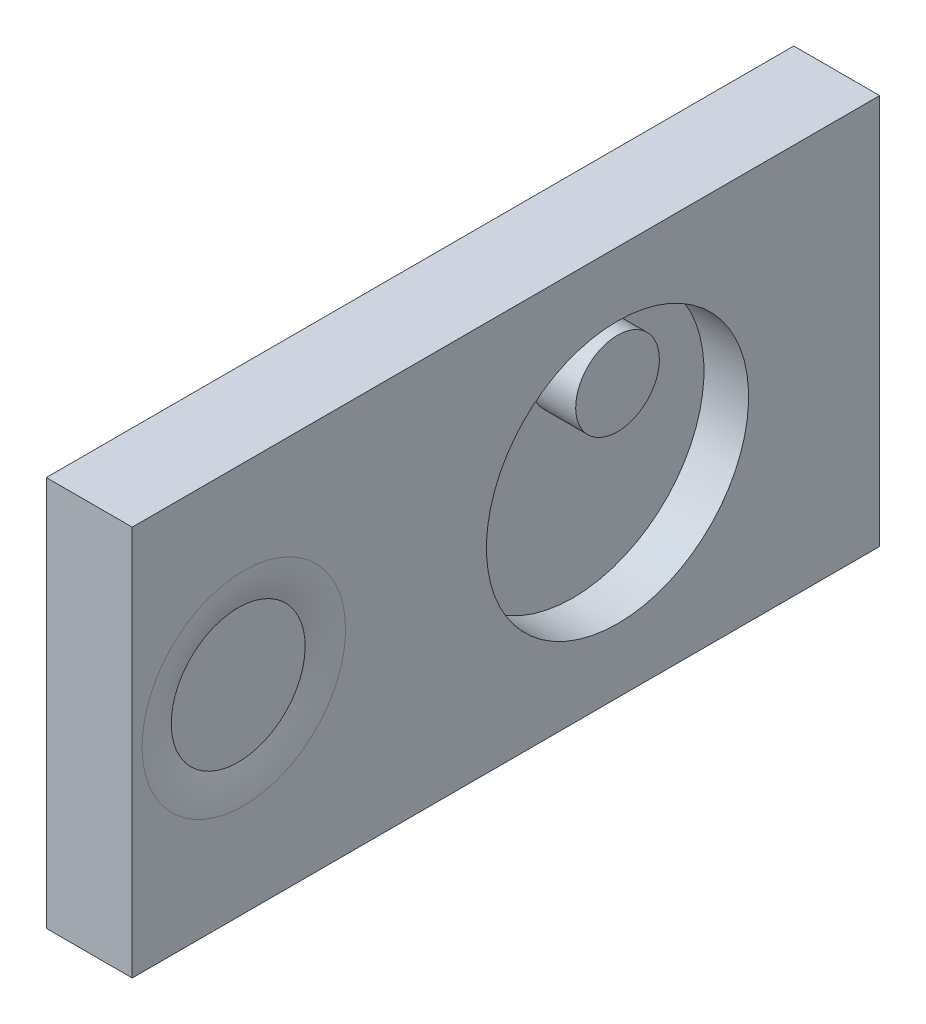
ISO-10303-21;
HEADER;
FILE_DESCRIPTION(('STEP AP214'),'2;1');
FILE_NAME('part.step','',(''),(''),'','','');
FILE_SCHEMA(('AUTOMOTIVE_DESIGN { 1 0 10303 214 1 1 1 1 }'));
ENDSEC;
DATA;
#1=APPLICATION_CONTEXT('core data for automotive mechanical design processes');
#2=APPLICATION_PROTOCOL_DEFINITION('international standard','automotive_design',2000,#1);
#3=PRODUCT_CONTEXT('',#1,'mechanical');
#4=PRODUCT('Part','Part','',(#3));
#5=PRODUCT_RELATED_PRODUCT_CATEGORY('part','',(#4));
#6=PRODUCT_DEFINITION_FORMATION('','',#4);
#7=PRODUCT_DEFINITION_CONTEXT('part definition',#1,'design');
#8=PRODUCT_DEFINITION('design','',#6,#7);
#9=PRODUCT_DEFINITION_SHAPE('','',#8);
#10=(LENGTH_UNIT() NAMED_UNIT(*) SI_UNIT(.MILLI.,.METRE.));
#11=(NAMED_UNIT(*) PLANE_ANGLE_UNIT() SI_UNIT($,.RADIAN.));
#12=(NAMED_UNIT(*) SI_UNIT($,.STERADIAN.) SOLID_ANGLE_UNIT());
#13=UNCERTAINTY_MEASURE_WITH_UNIT(LENGTH_MEASURE(1.E-05),#10,'distance_accuracy_value','');
#14=(GEOMETRIC_REPRESENTATION_CONTEXT(3) GLOBAL_UNCERTAINTY_ASSIGNED_CONTEXT((#13)) GLOBAL_UNIT_ASSIGNED_CONTEXT((#10,
#11,#12)) REPRESENTATION_CONTEXT('',''));
#15=CARTESIAN_POINT('',(0.,0.,0.));
#16=DIRECTION('',(0.,0.,1.));
#17=DIRECTION('',(1.,0.,0.));
#18=AXIS2_PLACEMENT_3D('',#15,#16,#17);
#19=CARTESIAN_POINT('',(0.,0.,-47.));
#20=DIRECTION('',(-1.,0.,0.));
#21=DIRECTION('',(0.,0.,1.));
#22=AXIS2_PLACEMENT_3D('',#19,#20,#21);
#23=PLANE('',#22);
#24=DIRECTION('',(0.,0.,1.));
#25=VECTOR('',#24,1.);
#26=CARTESIAN_POINT('',(0.,0.,-47.));
#27=LINE('',#26,#25);
#28=CARTESIAN_POINT('',(0.,0.,-47.));
#29=VERTEX_POINT('',#28);
#30=CARTESIAN_POINT('',(0.,0.,20.));
#31=VERTEX_POINT('',#30);
#32=EDGE_CURVE('E84',#29,#31,#27,.T.);
#33=ORIENTED_EDGE('',*,*,#32,.T.);
#34=DIRECTION('',(0.,-1.,0.));
#35=VECTOR('',#34,1.);
#36=CARTESIAN_POINT('',(0.,35.,20.));
#37=LINE('',#36,#35);
#38=CARTESIAN_POINT('',(0.,35.,20.));
#39=VERTEX_POINT('',#38);
#40=EDGE_CURVE('E87',#39,#31,#37,.T.);
#41=ORIENTED_EDGE('',*,*,#40,.F.);
#42=DIRECTION('',(0.,0.,1.));
#43=VECTOR('',#42,1.);
#44=CARTESIAN_POINT('',(0.,35.,-47.));
#45=LINE('',#44,#43);
#46=CARTESIAN_POINT('',(0.,35.,-47.));
#47=VERTEX_POINT('',#46);
#48=EDGE_CURVE('E53',#47,#39,#45,.T.);
#49=ORIENTED_EDGE('',*,*,#48,.F.);
#50=DIRECTION('',(0.,-1.,0.));
#51=VECTOR('',#50,1.);
#52=CARTESIAN_POINT('',(0.,0.,-47.));
#53=LINE('',#52,#51);
#54=EDGE_CURVE('E88',#47,#29,#53,.T.);
#55=ORIENTED_EDGE('',*,*,#54,.T.);
#56=EDGE_LOOP('',(#33,#41,#49,#55));
#57=FACE_BOUND('',#56,.T.);
#58=ADVANCED_FACE('F44',(#57),#23,.T.);
#59=CARTESIAN_POINT('',(0.,35.,-47.));
#60=DIRECTION('',(0.,1.,0.));
#61=DIRECTION('',(0.,0.,1.));
#62=AXIS2_PLACEMENT_3D('',#59,#60,#61);
#63=PLANE('',#62);
#64=ORIENTED_EDGE('',*,*,#48,.T.);
#65=DIRECTION('',(-1.,0.,0.));
#66=VECTOR('',#65,1.);
#67=CARTESIAN_POINT('',(0.,35.,20.));
#68=LINE('',#67,#66);
#69=CARTESIAN_POINT('',(7.7,35.,20.));
#70=VERTEX_POINT('',#69);
#71=EDGE_CURVE('E106',#70,#39,#68,.T.);
#72=ORIENTED_EDGE('',*,*,#71,.F.);
#73=DIRECTION('',(0.,0.,1.));
#74=VECTOR('',#73,1.);
#75=CARTESIAN_POINT('',(7.69999999999999,35.,-47.));
#76=LINE('',#75,#74);
#77=CARTESIAN_POINT('',(7.69999999999999,35.,-47.));
#78=VERTEX_POINT('',#77);
#79=EDGE_CURVE('E67',#78,#70,#76,.T.);
#80=ORIENTED_EDGE('',*,*,#79,.F.);
#81=DIRECTION('',(-1.,0.,0.));
#82=VECTOR('',#81,1.);
#83=CARTESIAN_POINT('',(0.,35.,-47.));
#84=LINE('',#83,#82);
#85=EDGE_CURVE('E94',#78,#47,#84,.T.);
#86=ORIENTED_EDGE('',*,*,#85,.T.);
#87=EDGE_LOOP('',(#64,#72,#80,#86));
#88=FACE_BOUND('',#87,.T.);
#89=ADVANCED_FACE('F153',(#88),#63,.T.);
#90=CARTESIAN_POINT('',(7.7,0.,-47.));
#91=DIRECTION('',(1.,0.,0.));
#92=DIRECTION('',(0.,1.,0.));
#93=AXIS2_PLACEMENT_3D('',#90,#91,#92);
#94=PLANE('',#93);
#95=CARTESIAN_POINT('',(7.7,17.5,10.));
#96=DIRECTION('',(1.,0.,0.));
#97=DIRECTION('',(0.,1.,0.));
#98=AXIS2_PLACEMENT_3D('',#95,#96,#97);
#99=CIRCLE('',#98,9.12249899919919);
#100=CARTESIAN_POINT('',(7.7,26.6224989991992,10.));
#101=VERTEX_POINT('',#100);
#102=EDGE_CURVE('E11',#101,#101,#99,.F.);
#103=ORIENTED_EDGE('',*,*,#102,.T.);
#104=EDGE_LOOP('',(#103));
#105=FACE_BOUND('',#104,.T.);
#106=CARTESIAN_POINT('',(7.7,17.5,-23.5));
#107=DIRECTION('',(1.,0.,0.));
#108=DIRECTION('',(0.,1.,0.));
#109=AXIS2_PLACEMENT_3D('',#106,#107,#108);
#110=CIRCLE('',#109,11.75);
#111=CARTESIAN_POINT('',(7.69999999999999,29.25,-23.5));
#112=VERTEX_POINT('',#111);
#113=EDGE_CURVE('E123',#112,#112,#110,.T.);
#114=ORIENTED_EDGE('',*,*,#113,.F.);
#115=EDGE_LOOP('',(#114));
#116=FACE_BOUND('',#115,.T.);
#117=ORIENTED_EDGE('',*,*,#79,.T.);
#118=DIRECTION('',(0.,1.,0.));
#119=VECTOR('',#118,1.);
#120=CARTESIAN_POINT('',(7.7,35.,20.));
#121=LINE('',#120,#119);
#122=CARTESIAN_POINT('',(7.7,0.,20.));
#123=VERTEX_POINT('',#122);
#124=EDGE_CURVE('E102',#123,#70,#121,.T.);
#125=ORIENTED_EDGE('',*,*,#124,.F.);
#126=DIRECTION('',(0.,0.,1.));
#127=VECTOR('',#126,1.);
#128=CARTESIAN_POINT('',(7.7,0.,-47.));
#129=LINE('',#128,#127);
#130=CARTESIAN_POINT('',(7.7,0.,-47.));
#131=VERTEX_POINT('',#130);
#132=EDGE_CURVE('E93',#131,#123,#129,.T.);
#133=ORIENTED_EDGE('',*,*,#132,.F.);
#134=DIRECTION('',(0.,1.,0.));
#135=VECTOR('',#134,1.);
#136=CARTESIAN_POINT('',(7.7,0.,-47.));
#137=LINE('',#136,#135);
#138=EDGE_CURVE('E139',#131,#78,#137,.T.);
#139=ORIENTED_EDGE('',*,*,#138,.T.);
#140=EDGE_LOOP('',(#117,#125,#133,#139));
#141=FACE_BOUND('',#140,.T.);
#142=ADVANCED_FACE('F150',(#105,#116,#141),#94,.T.);
#143=CARTESIAN_POINT('',(0.,0.,-47.));
#144=DIRECTION('',(0.,-1.,0.));
#145=DIRECTION('',(0.,0.,-1.));
#146=AXIS2_PLACEMENT_3D('',#143,#144,#145);
#147=PLANE('',#146);
#148=ORIENTED_EDGE('',*,*,#132,.T.);
#149=DIRECTION('',(1.,0.,0.));
#150=VECTOR('',#149,1.);
#151=CARTESIAN_POINT('',(0.,0.,20.));
#152=LINE('',#151,#150);
#153=EDGE_CURVE('E96',#31,#123,#152,.T.);
#154=ORIENTED_EDGE('',*,*,#153,.F.);
#155=ORIENTED_EDGE('',*,*,#32,.F.);
#156=DIRECTION('',(1.,0.,0.));
#157=VECTOR('',#156,1.);
#158=CARTESIAN_POINT('',(0.,0.,-47.));
#159=LINE('',#158,#157);
#160=EDGE_CURVE('E136',#29,#131,#159,.T.);
#161=ORIENTED_EDGE('',*,*,#160,.T.);
#162=EDGE_LOOP('',(#148,#154,#155,#161));
#163=FACE_BOUND('',#162,.T.);
#164=ADVANCED_FACE('F97',(#163),#147,.T.);
#165=CARTESIAN_POINT('',(0.,0.,-47.));
#166=DIRECTION('',(0.,0.,-1.));
#167=DIRECTION('',(-1.,0.,0.));
#168=AXIS2_PLACEMENT_3D('',#165,#166,#167);
#169=PLANE('',#168);
#170=ORIENTED_EDGE('',*,*,#54,.F.);
#171=ORIENTED_EDGE('',*,*,#85,.F.);
#172=ORIENTED_EDGE('',*,*,#138,.F.);
#173=ORIENTED_EDGE('',*,*,#160,.F.);
#174=EDGE_LOOP('',(#170,#171,#172,#173));
#175=FACE_BOUND('',#174,.T.);
#176=ADVANCED_FACE('F155',(#175),#169,.T.);
#177=CARTESIAN_POINT('',(3.7,17.5,-23.5));
#178=DIRECTION('',(1.,0.,0.));
#179=DIRECTION('',(0.,1.,0.));
#180=AXIS2_PLACEMENT_3D('',#177,#178,#179);
#181=CYLINDRICAL_SURFACE('',#180,11.75);
#182=CARTESIAN_POINT('',(3.7,17.5,-23.5));
#183=DIRECTION('',(1.,0.,0.));
#184=DIRECTION('',(0.,1.,0.));
#185=AXIS2_PLACEMENT_3D('',#182,#183,#184);
#186=CIRCLE('',#185,11.75);
#187=CARTESIAN_POINT('',(3.7,29.25,-23.5));
#188=VERTEX_POINT('',#187);
#189=EDGE_CURVE('E127',#188,#188,#186,.T.);
#190=ORIENTED_EDGE('',*,*,#189,.F.);
#191=EDGE_LOOP('',(#190));
#192=FACE_BOUND('',#191,.T.);
#193=ORIENTED_EDGE('',*,*,#113,.T.);
#194=EDGE_LOOP('',(#193));
#195=FACE_BOUND('',#194,.T.);
#196=ADVANCED_FACE('F157',(#192,#195),#181,.F.);
#197=CARTESIAN_POINT('',(3.7,17.5,-23.5));
#198=DIRECTION('',(1.,0.,0.));
#199=DIRECTION('',(0.,1.,0.));
#200=AXIS2_PLACEMENT_3D('',#197,#198,#199);
#201=PLANE('',#200);
#202=CARTESIAN_POINT('',(3.7,24.4,-23.5));
#203=DIRECTION('',(1.,0.,0.));
#204=DIRECTION('',(0.,1.,0.));
#205=AXIS2_PLACEMENT_3D('',#202,#203,#204);
#206=CIRCLE('',#205,3.75);
#207=CARTESIAN_POINT('',(3.69999999999999,28.15,-23.5));
#208=VERTEX_POINT('',#207);
#209=EDGE_CURVE('E119',#208,#208,#206,.T.);
#210=ORIENTED_EDGE('',*,*,#209,.F.);
#211=EDGE_LOOP('',(#210));
#212=FACE_BOUND('',#211,.T.);
#213=ORIENTED_EDGE('',*,*,#189,.T.);
#214=EDGE_LOOP('',(#213));
#215=FACE_BOUND('',#214,.T.);
#216=ADVANCED_FACE('F162',(#212,#215),#201,.T.);
#217=CARTESIAN_POINT('',(3.7,24.4,-23.5));
#218=DIRECTION('',(1.,0.,0.));
#219=DIRECTION('',(0.,1.,0.));
#220=AXIS2_PLACEMENT_3D('',#217,#218,#219);
#221=CYLINDRICAL_SURFACE('',#220,3.75);
#222=ORIENTED_EDGE('',*,*,#209,.T.);
#223=EDGE_LOOP('',(#222));
#224=FACE_BOUND('',#223,.T.);
#225=CARTESIAN_POINT('',(7.7,24.4,-23.5));
#226=DIRECTION('',(1.,0.,0.));
#227=DIRECTION('',(0.,1.,0.));
#228=AXIS2_PLACEMENT_3D('',#225,#226,#227);
#229=CIRCLE('',#228,3.75);
#230=CARTESIAN_POINT('',(7.69999999999999,28.15,-23.5));
#231=VERTEX_POINT('',#230);
#232=EDGE_CURVE('E118',#231,#231,#229,.T.);
#233=ORIENTED_EDGE('',*,*,#232,.F.);
#234=EDGE_LOOP('',(#233));
#235=FACE_BOUND('',#234,.T.);
#236=ADVANCED_FACE('F182',(#224,#235),#221,.T.);
#237=ORIENTED_EDGE('',*,*,#232,.T.);
#238=EDGE_LOOP('',(#237));
#239=FACE_BOUND('',#238,.T.);
#240=ADVANCED_FACE('F176',(#239),#94,.T.);
#241=CARTESIAN_POINT('',(0.,0.,20.));
#242=DIRECTION('',(0.,0.,1.));
#243=DIRECTION('',(1.,0.,0.));
#244=AXIS2_PLACEMENT_3D('',#241,#242,#243);
#245=PLANE('',#244);
#246=ORIENTED_EDGE('',*,*,#40,.T.);
#247=ORIENTED_EDGE('',*,*,#153,.T.);
#248=ORIENTED_EDGE('',*,*,#124,.T.);
#249=ORIENTED_EDGE('',*,*,#71,.T.);
#250=EDGE_LOOP('',(#246,#247,#248,#249));
#251=FACE_BOUND('',#250,.T.);
#252=ADVANCED_FACE('F105',(#251),#245,.T.);
#253=CARTESIAN_POINT('',(7.2,17.5,10.));
#254=DIRECTION('',(1.,0.,0.));
#255=DIRECTION('',(0.,1.,0.));
#256=AXIS2_PLACEMENT_3D('',#253,#254,#255);
#257=PLANE('',#256);
#258=CARTESIAN_POINT('',(7.2,17.5,10.));
#259=DIRECTION('',(1.,0.,0.));
#260=DIRECTION('',(0.,1.,0.));
#261=AXIS2_PLACEMENT_3D('',#258,#259,#260);
#262=CIRCLE('',#261,6.);
#263=CARTESIAN_POINT('',(7.2,23.5,10.));
#264=VERTEX_POINT('',#263);
#265=EDGE_CURVE('E108',#264,#264,#262,.T.);
#266=ORIENTED_EDGE('',*,*,#265,.T.);
#267=EDGE_LOOP('',(#266));
#268=FACE_BOUND('',#267,.T.);
#269=ADVANCED_FACE('F188',(#268),#257,.T.);
#270=CARTESIAN_POINT('',(-2.3,17.5,10.));
#271=DIRECTION('',(1.,0.,0.));
#272=DIRECTION('',(0.,1.,0.));
#273=AXIS2_PLACEMENT_3D('',#270,#271,#272);
#274=DEGENERATE_TOROIDAL_SURFACE('',#273,9.12249899919919,10.,.T.);
#275=ORIENTED_EDGE('',*,*,#102,.F.);
#276=EDGE_LOOP('',(#275));
#277=FACE_BOUND('',#276,.T.);
#278=ORIENTED_EDGE('',*,*,#265,.F.);
#279=EDGE_LOOP('',(#278));
#280=FACE_BOUND('',#279,.T.);
#281=ADVANCED_FACE('F46',(#277,#280),#274,.T.);
#282=CLOSED_SHELL('',(#58,#89,#142,#164,#176,#196,#216,#236,#240,#252,#269,#281));
#283=MANIFOLD_SOLID_BREP('B2',#282);
#284=ADVANCED_BREP_SHAPE_REPRESENTATION('',(#18,#283),#14);
#285=SHAPE_DEFINITION_REPRESENTATION(#9,#284);
ENDSEC;
END-ISO-10303-21;
